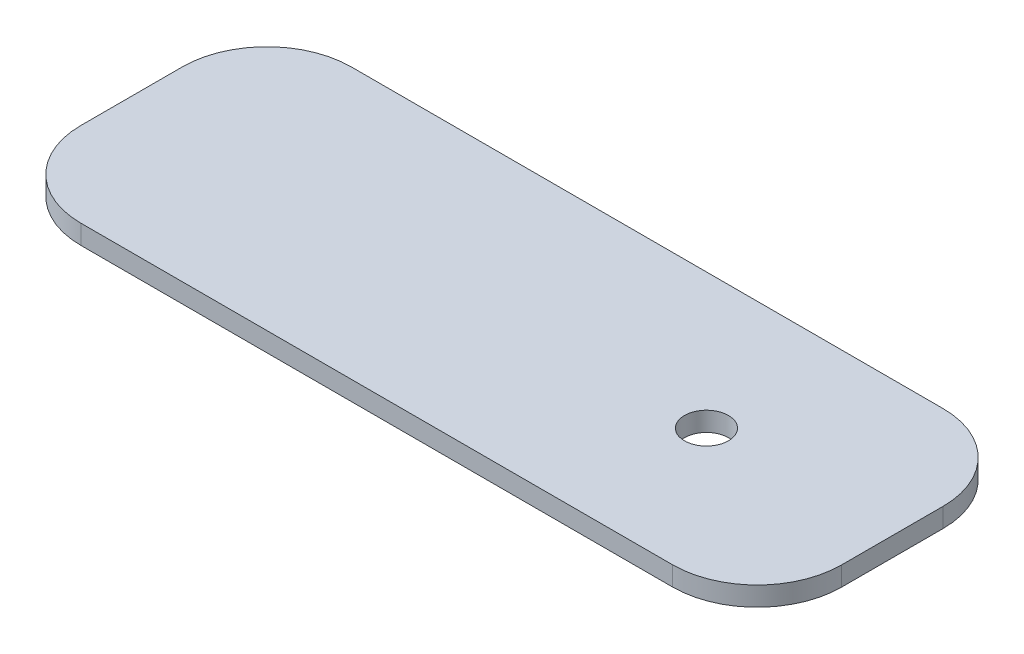
ISO-10303-21;
HEADER;
FILE_DESCRIPTION(('STEP AP214'),'2;1');
FILE_NAME('part.step','',(''),(''),'','','');
FILE_SCHEMA(('AUTOMOTIVE_DESIGN { 1 0 10303 214 1 1 1 1 }'));
ENDSEC;
DATA;
#1=APPLICATION_CONTEXT('core data for automotive mechanical design processes');
#2=APPLICATION_PROTOCOL_DEFINITION('international standard','automotive_design',2000,#1);
#3=PRODUCT_CONTEXT('',#1,'mechanical');
#4=PRODUCT('Part','Part','',(#3));
#5=PRODUCT_RELATED_PRODUCT_CATEGORY('part','',(#4));
#6=PRODUCT_DEFINITION_FORMATION('','',#4);
#7=PRODUCT_DEFINITION_CONTEXT('part definition',#1,'design');
#8=PRODUCT_DEFINITION('design','',#6,#7);
#9=PRODUCT_DEFINITION_SHAPE('','',#8);
#10=(LENGTH_UNIT() NAMED_UNIT(*) SI_UNIT(.MILLI.,.METRE.));
#11=(NAMED_UNIT(*) PLANE_ANGLE_UNIT() SI_UNIT($,.RADIAN.));
#12=(NAMED_UNIT(*) SI_UNIT($,.STERADIAN.) SOLID_ANGLE_UNIT());
#13=UNCERTAINTY_MEASURE_WITH_UNIT(LENGTH_MEASURE(1.E-05),#10,'distance_accuracy_value','');
#14=(GEOMETRIC_REPRESENTATION_CONTEXT(3) GLOBAL_UNCERTAINTY_ASSIGNED_CONTEXT((#13)) GLOBAL_UNIT_ASSIGNED_CONTEXT((#10,
#11,#12)) REPRESENTATION_CONTEXT('',''));
#15=CARTESIAN_POINT('',(0.,0.,0.));
#16=DIRECTION('',(0.,0.,1.));
#17=DIRECTION('',(1.,0.,0.));
#18=AXIS2_PLACEMENT_3D('',#15,#16,#17);
#19=CARTESIAN_POINT('',(200.,5.7,-55.));
#20=DIRECTION('',(0.,-1.,0.));
#21=DIRECTION('',(0.,0.,-1.));
#22=AXIS2_PLACEMENT_3D('',#19,#20,#21);
#23=PLANE('',#22);
#24=CARTESIAN_POINT('',(170.,5.7,-40.));
#25=DIRECTION('',(0.,-1.,0.));
#26=DIRECTION('',(0.,0.,-1.));
#27=AXIS2_PLACEMENT_3D('',#24,#25,#26);
#28=CIRCLE('',#27,6.50000000000001);
#29=CARTESIAN_POINT('',(170.,5.7,-46.5));
#30=VERTEX_POINT('',#29);
#31=EDGE_CURVE('E98',#30,#30,#28,.T.);
#32=ORIENTED_EDGE('',*,*,#31,.T.);
#33=EDGE_LOOP('',(#32));
#34=FACE_BOUND('',#33,.T.);
#35=DIRECTION('',(1.,0.,0.));
#36=VECTOR('',#35,1.);
#37=CARTESIAN_POINT('',(200.,5.7,-80.));
#38=LINE('',#37,#36);
#39=CARTESIAN_POINT('',(200.,5.7,-80.));
#40=VERTEX_POINT('',#39);
#41=CARTESIAN_POINT('',(25.0000000000001,5.7,-80.));
#42=VERTEX_POINT('',#41);
#43=EDGE_CURVE('E82',#40,#42,#38,.F.);
#44=ORIENTED_EDGE('',*,*,#43,.T.);
#45=CARTESIAN_POINT('',(25.,5.7,-55.));
#46=DIRECTION('',(0.,-1.,0.));
#47=DIRECTION('',(0.,0.,-1.));
#48=AXIS2_PLACEMENT_3D('',#45,#46,#47);
#49=CIRCLE('',#48,25.);
#50=CARTESIAN_POINT('',(0.,5.7,-54.9999999999999));
#51=VERTEX_POINT('',#50);
#52=EDGE_CURVE('E94',#51,#42,#49,.T.);
#53=ORIENTED_EDGE('',*,*,#52,.F.);
#54=DIRECTION('',(0.,0.,-1.));
#55=VECTOR('',#54,1.);
#56=CARTESIAN_POINT('',(0.,5.7,-54.9999999999998));
#57=LINE('',#56,#55);
#58=CARTESIAN_POINT('',(0.,5.7,-25.0000000000001));
#59=VERTEX_POINT('',#58);
#60=EDGE_CURVE('E104',#51,#59,#57,.F.);
#61=ORIENTED_EDGE('',*,*,#60,.T.);
#62=CARTESIAN_POINT('',(25.,5.7,-25.));
#63=DIRECTION('',(0.,-1.,0.));
#64=DIRECTION('',(0.,0.,-1.));
#65=AXIS2_PLACEMENT_3D('',#62,#63,#64);
#66=CIRCLE('',#65,25.);
#67=CARTESIAN_POINT('',(25.0000000000001,5.7,0.));
#68=VERTEX_POINT('',#67);
#69=EDGE_CURVE('E107',#68,#59,#66,.T.);
#70=ORIENTED_EDGE('',*,*,#69,.F.);
#71=DIRECTION('',(-1.,0.,0.));
#72=VECTOR('',#71,1.);
#73=CARTESIAN_POINT('',(25.0000000000002,5.7,0.));
#74=LINE('',#73,#72);
#75=CARTESIAN_POINT('',(200.,5.7,0.));
#76=VERTEX_POINT('',#75);
#77=EDGE_CURVE('E108',#68,#76,#74,.F.);
#78=ORIENTED_EDGE('',*,*,#77,.T.);
#79=CARTESIAN_POINT('',(200.,5.7,-25.));
#80=DIRECTION('',(0.,-1.,0.));
#81=DIRECTION('',(0.,0.,-1.));
#82=AXIS2_PLACEMENT_3D('',#79,#80,#81);
#83=CIRCLE('',#82,25.);
#84=CARTESIAN_POINT('',(225.,5.7,-25.0000000000001));
#85=VERTEX_POINT('',#84);
#86=EDGE_CURVE('E111',#85,#76,#83,.T.);
#87=ORIENTED_EDGE('',*,*,#86,.F.);
#88=DIRECTION('',(0.,0.,1.));
#89=VECTOR('',#88,1.);
#90=CARTESIAN_POINT('',(225.,5.7,-25.0000000000002));
#91=LINE('',#90,#89);
#92=CARTESIAN_POINT('',(225.,5.7,-54.9999999999999));
#93=VERTEX_POINT('',#92);
#94=EDGE_CURVE('E84',#85,#93,#91,.F.);
#95=ORIENTED_EDGE('',*,*,#94,.T.);
#96=CARTESIAN_POINT('',(200.,5.7,-55.));
#97=DIRECTION('',(0.,-1.,0.));
#98=DIRECTION('',(0.,0.,-1.));
#99=AXIS2_PLACEMENT_3D('',#96,#97,#98);
#100=CIRCLE('',#99,25.);
#101=EDGE_CURVE('E19',#40,#93,#100,.T.);
#102=ORIENTED_EDGE('',*,*,#101,.F.);
#103=EDGE_LOOP('',(#44,#53,#61,#70,#78,#87,#95,#102));
#104=FACE_BOUND('',#103,.T.);
#105=ADVANCED_FACE('F16',(#34,#104),#23,.F.);
#106=CARTESIAN_POINT('',(200.,5.7,-55.));
#107=DIRECTION('',(0.,-1.,0.));
#108=DIRECTION('',(0.,0.,-1.));
#109=AXIS2_PLACEMENT_3D('',#106,#107,#108);
#110=CYLINDRICAL_SURFACE('',#109,25.);
#111=ORIENTED_EDGE('',*,*,#101,.T.);
#112=DIRECTION('',(0.,1.,0.));
#113=VECTOR('',#112,1.);
#114=CARTESIAN_POINT('',(225.,5.7,-54.9999999999998));
#115=LINE('',#114,#113);
#116=CARTESIAN_POINT('',(225.,0.,-54.9999999999999));
#117=VERTEX_POINT('',#116);
#118=EDGE_CURVE('E102',#93,#117,#115,.F.);
#119=ORIENTED_EDGE('',*,*,#118,.T.);
#120=CARTESIAN_POINT('',(200.,0.,-55.));
#121=DIRECTION('',(0.,-1.,0.));
#122=DIRECTION('',(0.,0.,-1.));
#123=AXIS2_PLACEMENT_3D('',#120,#121,#122);
#124=CIRCLE('',#123,25.);
#125=CARTESIAN_POINT('',(200.,0.,-80.));
#126=VERTEX_POINT('',#125);
#127=EDGE_CURVE('E91',#126,#117,#124,.T.);
#128=ORIENTED_EDGE('',*,*,#127,.F.);
#129=DIRECTION('',(0.,1.,0.));
#130=VECTOR('',#129,1.);
#131=CARTESIAN_POINT('',(200.,5.7,-80.));
#132=LINE('',#131,#130);
#133=EDGE_CURVE('E88',#126,#40,#132,.T.);
#134=ORIENTED_EDGE('',*,*,#133,.T.);
#135=EDGE_LOOP('',(#111,#119,#128,#134));
#136=FACE_BOUND('',#135,.T.);
#137=ADVANCED_FACE('F89',(#136),#110,.T.);
#138=CARTESIAN_POINT('',(225.,5.7,-25.0000000000002));
#139=DIRECTION('',(-1.,0.,0.));
#140=DIRECTION('',(0.,0.,1.));
#141=AXIS2_PLACEMENT_3D('',#138,#139,#140);
#142=PLANE('',#141);
#143=ORIENTED_EDGE('',*,*,#118,.F.);
#144=ORIENTED_EDGE('',*,*,#94,.F.);
#145=DIRECTION('',(0.,-1.,0.));
#146=VECTOR('',#145,1.);
#147=CARTESIAN_POINT('',(225.,5.7,-25.0000000000002));
#148=LINE('',#147,#146);
#149=CARTESIAN_POINT('',(225.,0.,-25.0000000000001));
#150=VERTEX_POINT('',#149);
#151=EDGE_CURVE('E133',#150,#85,#148,.F.);
#152=ORIENTED_EDGE('',*,*,#151,.F.);
#153=DIRECTION('',(0.,0.,-1.));
#154=VECTOR('',#153,1.);
#155=CARTESIAN_POINT('',(225.,0.,-55.));
#156=LINE('',#155,#154);
#157=EDGE_CURVE('E124',#117,#150,#156,.F.);
#158=ORIENTED_EDGE('',*,*,#157,.F.);
#159=EDGE_LOOP('',(#143,#144,#152,#158));
#160=FACE_BOUND('',#159,.T.);
#161=ADVANCED_FACE('F168',(#160),#142,.F.);
#162=CARTESIAN_POINT('',(200.,5.7,-25.));
#163=DIRECTION('',(0.,-1.,0.));
#164=DIRECTION('',(0.,0.,-1.));
#165=AXIS2_PLACEMENT_3D('',#162,#163,#164);
#166=CYLINDRICAL_SURFACE('',#165,25.);
#167=ORIENTED_EDGE('',*,*,#86,.T.);
#168=DIRECTION('',(0.,1.,0.));
#169=VECTOR('',#168,1.);
#170=CARTESIAN_POINT('',(200.,5.7,0.));
#171=LINE('',#170,#169);
#172=CARTESIAN_POINT('',(200.,0.,0.));
#173=VERTEX_POINT('',#172);
#174=EDGE_CURVE('E110',#76,#173,#171,.F.);
#175=ORIENTED_EDGE('',*,*,#174,.T.);
#176=CARTESIAN_POINT('',(200.,0.,-25.));
#177=DIRECTION('',(0.,-1.,0.));
#178=DIRECTION('',(0.,0.,-1.));
#179=AXIS2_PLACEMENT_3D('',#176,#177,#178);
#180=CIRCLE('',#179,25.);
#181=EDGE_CURVE('E121',#150,#173,#180,.T.);
#182=ORIENTED_EDGE('',*,*,#181,.F.);
#183=ORIENTED_EDGE('',*,*,#151,.T.);
#184=EDGE_LOOP('',(#167,#175,#182,#183));
#185=FACE_BOUND('',#184,.T.);
#186=ADVANCED_FACE('F165',(#185),#166,.T.);
#187=CARTESIAN_POINT('',(25.0000000000002,5.7,0.));
#188=DIRECTION('',(0.,0.,-1.));
#189=DIRECTION('',(-1.,0.,0.));
#190=AXIS2_PLACEMENT_3D('',#187,#188,#189);
#191=PLANE('',#190);
#192=ORIENTED_EDGE('',*,*,#174,.F.);
#193=ORIENTED_EDGE('',*,*,#77,.F.);
#194=DIRECTION('',(0.,-1.,0.));
#195=VECTOR('',#194,1.);
#196=CARTESIAN_POINT('',(25.0000000000002,5.7,0.));
#197=LINE('',#196,#195);
#198=CARTESIAN_POINT('',(25.0000000000001,0.,0.));
#199=VERTEX_POINT('',#198);
#200=EDGE_CURVE('E131',#199,#68,#197,.F.);
#201=ORIENTED_EDGE('',*,*,#200,.F.);
#202=DIRECTION('',(1.,0.,0.));
#203=VECTOR('',#202,1.);
#204=CARTESIAN_POINT('',(200.,0.,0.));
#205=LINE('',#204,#203);
#206=EDGE_CURVE('E120',#173,#199,#205,.F.);
#207=ORIENTED_EDGE('',*,*,#206,.F.);
#208=EDGE_LOOP('',(#192,#193,#201,#207));
#209=FACE_BOUND('',#208,.T.);
#210=ADVANCED_FACE('F164',(#209),#191,.F.);
#211=CARTESIAN_POINT('',(25.,5.7,-25.));
#212=DIRECTION('',(0.,-1.,0.));
#213=DIRECTION('',(0.,0.,-1.));
#214=AXIS2_PLACEMENT_3D('',#211,#212,#213);
#215=CYLINDRICAL_SURFACE('',#214,25.);
#216=ORIENTED_EDGE('',*,*,#69,.T.);
#217=DIRECTION('',(0.,1.,0.));
#218=VECTOR('',#217,1.);
#219=CARTESIAN_POINT('',(0.,5.7,-25.0000000000002));
#220=LINE('',#219,#218);
#221=CARTESIAN_POINT('',(0.,0.,-25.0000000000001));
#222=VERTEX_POINT('',#221);
#223=EDGE_CURVE('E106',#59,#222,#220,.F.);
#224=ORIENTED_EDGE('',*,*,#223,.T.);
#225=CARTESIAN_POINT('',(25.,0.,-25.));
#226=DIRECTION('',(0.,-1.,0.));
#227=DIRECTION('',(0.,0.,-1.));
#228=AXIS2_PLACEMENT_3D('',#225,#226,#227);
#229=CIRCLE('',#228,25.);
#230=EDGE_CURVE('E117',#199,#222,#229,.T.);
#231=ORIENTED_EDGE('',*,*,#230,.F.);
#232=ORIENTED_EDGE('',*,*,#200,.T.);
#233=EDGE_LOOP('',(#216,#224,#231,#232));
#234=FACE_BOUND('',#233,.T.);
#235=ADVANCED_FACE('F160',(#234),#215,.T.);
#236=CARTESIAN_POINT('',(0.,5.7,-54.9999999999998));
#237=DIRECTION('',(1.,0.,0.));
#238=DIRECTION('',(0.,0.,-1.));
#239=AXIS2_PLACEMENT_3D('',#236,#237,#238);
#240=PLANE('',#239);
#241=ORIENTED_EDGE('',*,*,#223,.F.);
#242=ORIENTED_EDGE('',*,*,#60,.F.);
#243=DIRECTION('',(0.,-1.,0.));
#244=VECTOR('',#243,1.);
#245=CARTESIAN_POINT('',(0.,5.7,-54.9999999999998));
#246=LINE('',#245,#244);
#247=CARTESIAN_POINT('',(0.,0.,-54.9999999999999));
#248=VERTEX_POINT('',#247);
#249=EDGE_CURVE('E129',#248,#51,#246,.F.);
#250=ORIENTED_EDGE('',*,*,#249,.F.);
#251=DIRECTION('',(0.,0.,-1.));
#252=VECTOR('',#251,1.);
#253=CARTESIAN_POINT('',(0.,0.,-55.));
#254=LINE('',#253,#252);
#255=EDGE_CURVE('E116',#222,#248,#254,.T.);
#256=ORIENTED_EDGE('',*,*,#255,.F.);
#257=EDGE_LOOP('',(#241,#242,#250,#256));
#258=FACE_BOUND('',#257,.T.);
#259=ADVANCED_FACE('F157',(#258),#240,.F.);
#260=CARTESIAN_POINT('',(25.,5.7,-55.));
#261=DIRECTION('',(0.,-1.,0.));
#262=DIRECTION('',(0.,0.,-1.));
#263=AXIS2_PLACEMENT_3D('',#260,#261,#262);
#264=CYLINDRICAL_SURFACE('',#263,25.);
#265=ORIENTED_EDGE('',*,*,#52,.T.);
#266=DIRECTION('',(0.,1.,0.));
#267=VECTOR('',#266,1.);
#268=CARTESIAN_POINT('',(25.0000000000002,5.7,-80.));
#269=LINE('',#268,#267);
#270=CARTESIAN_POINT('',(25.0000000000001,0.,-80.));
#271=VERTEX_POINT('',#270);
#272=EDGE_CURVE('E34',#42,#271,#269,.F.);
#273=ORIENTED_EDGE('',*,*,#272,.T.);
#274=CARTESIAN_POINT('',(25.,0.,-55.));
#275=DIRECTION('',(0.,-1.,0.));
#276=DIRECTION('',(0.,0.,-1.));
#277=AXIS2_PLACEMENT_3D('',#274,#275,#276);
#278=CIRCLE('',#277,25.);
#279=EDGE_CURVE('E113',#248,#271,#278,.T.);
#280=ORIENTED_EDGE('',*,*,#279,.F.);
#281=ORIENTED_EDGE('',*,*,#249,.T.);
#282=EDGE_LOOP('',(#265,#273,#280,#281));
#283=FACE_BOUND('',#282,.T.);
#284=ADVANCED_FACE('F154',(#283),#264,.T.);
#285=CARTESIAN_POINT('',(200.,5.7,-80.));
#286=DIRECTION('',(0.,0.,1.));
#287=DIRECTION('',(1.,0.,0.));
#288=AXIS2_PLACEMENT_3D('',#285,#286,#287);
#289=PLANE('',#288);
#290=ORIENTED_EDGE('',*,*,#272,.F.);
#291=ORIENTED_EDGE('',*,*,#43,.F.);
#292=ORIENTED_EDGE('',*,*,#133,.F.);
#293=DIRECTION('',(1.,0.,0.));
#294=VECTOR('',#293,1.);
#295=CARTESIAN_POINT('',(200.,0.,-80.));
#296=LINE('',#295,#294);
#297=EDGE_CURVE('E25',#271,#126,#296,.T.);
#298=ORIENTED_EDGE('',*,*,#297,.F.);
#299=EDGE_LOOP('',(#290,#291,#292,#298));
#300=FACE_BOUND('',#299,.T.);
#301=ADVANCED_FACE('F96',(#300),#289,.F.);
#302=CARTESIAN_POINT('',(170.,5.7,-40.));
#303=DIRECTION('',(0.,-1.,0.));
#304=DIRECTION('',(0.,0.,-1.));
#305=AXIS2_PLACEMENT_3D('',#302,#303,#304);
#306=CYLINDRICAL_SURFACE('',#305,6.50000000000001);
#307=ORIENTED_EDGE('',*,*,#31,.F.);
#308=EDGE_LOOP('',(#307));
#309=FACE_BOUND('',#308,.T.);
#310=CARTESIAN_POINT('',(170.,0.,-40.));
#311=DIRECTION('',(0.,-1.,0.));
#312=DIRECTION('',(0.,0.,-1.));
#313=AXIS2_PLACEMENT_3D('',#310,#311,#312);
#314=CIRCLE('',#313,6.50000000000001);
#315=CARTESIAN_POINT('',(170.,0.,-46.5));
#316=VERTEX_POINT('',#315);
#317=EDGE_CURVE('E11',#316,#316,#314,.F.);
#318=ORIENTED_EDGE('',*,*,#317,.F.);
#319=EDGE_LOOP('',(#318));
#320=FACE_BOUND('',#319,.T.);
#321=ADVANCED_FACE('F179',(#309,#320),#306,.F.);
#322=CARTESIAN_POINT('',(200.,0.,-55.));
#323=DIRECTION('',(0.,-1.,0.));
#324=DIRECTION('',(0.,0.,-1.));
#325=AXIS2_PLACEMENT_3D('',#322,#323,#324);
#326=PLANE('',#325);
#327=ORIENTED_EDGE('',*,*,#317,.T.);
#328=EDGE_LOOP('',(#327));
#329=FACE_BOUND('',#328,.T.);
#330=ORIENTED_EDGE('',*,*,#279,.T.);
#331=ORIENTED_EDGE('',*,*,#297,.T.);
#332=ORIENTED_EDGE('',*,*,#127,.T.);
#333=ORIENTED_EDGE('',*,*,#157,.T.);
#334=ORIENTED_EDGE('',*,*,#181,.T.);
#335=ORIENTED_EDGE('',*,*,#206,.T.);
#336=ORIENTED_EDGE('',*,*,#230,.T.);
#337=ORIENTED_EDGE('',*,*,#255,.T.);
#338=EDGE_LOOP('',(#330,#331,#332,#333,#334,#335,#336,#337));
#339=FACE_BOUND('',#338,.T.);
#340=ADVANCED_FACE('F152',(#329,#339),#326,.T.);
#341=CLOSED_SHELL('',(#105,#137,#161,#186,#210,#235,#259,#284,#301,#321,#340));
#342=MANIFOLD_SOLID_BREP('B1',#341);
#343=ADVANCED_BREP_SHAPE_REPRESENTATION('',(#18,#342),#14);
#344=SHAPE_DEFINITION_REPRESENTATION(#9,#343);
ENDSEC;
END-ISO-10303-21;
